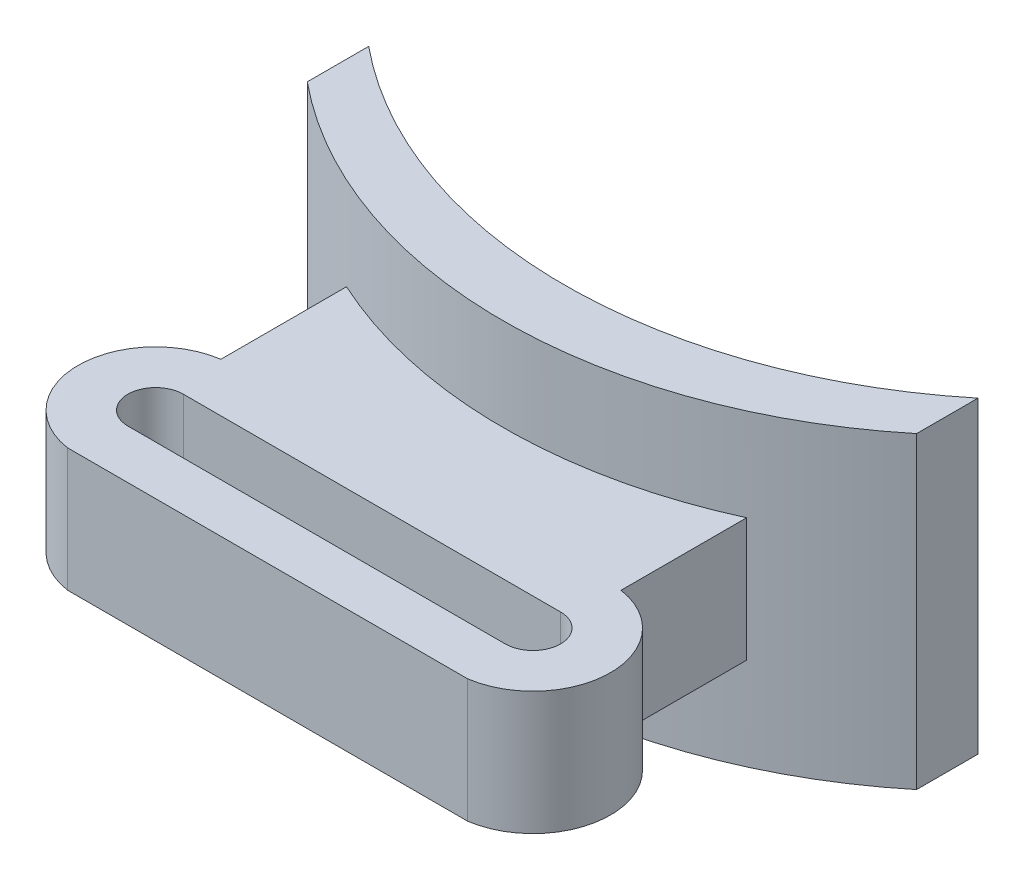
ISO-10303-21;
HEADER;
FILE_DESCRIPTION(('STEP AP214'),'2;1');
FILE_NAME('part.step','',(''),(''),'','','');
FILE_SCHEMA(('AUTOMOTIVE_DESIGN { 1 0 10303 214 1 1 1 1 }'));
ENDSEC;
DATA;
#1=APPLICATION_CONTEXT('core data for automotive mechanical design processes');
#2=APPLICATION_PROTOCOL_DEFINITION('international standard','automotive_design',2000,#1);
#3=PRODUCT_CONTEXT('',#1,'mechanical');
#4=PRODUCT('Part','Part','',(#3));
#5=PRODUCT_RELATED_PRODUCT_CATEGORY('part','',(#4));
#6=PRODUCT_DEFINITION_FORMATION('','',#4);
#7=PRODUCT_DEFINITION_CONTEXT('part definition',#1,'design');
#8=PRODUCT_DEFINITION('design','',#6,#7);
#9=PRODUCT_DEFINITION_SHAPE('','',#8);
#10=(LENGTH_UNIT() NAMED_UNIT(*) SI_UNIT(.MILLI.,.METRE.));
#11=(NAMED_UNIT(*) PLANE_ANGLE_UNIT() SI_UNIT($,.RADIAN.));
#12=(NAMED_UNIT(*) SI_UNIT($,.STERADIAN.) SOLID_ANGLE_UNIT());
#13=UNCERTAINTY_MEASURE_WITH_UNIT(LENGTH_MEASURE(1.E-05),#10,'distance_accuracy_value','');
#14=(GEOMETRIC_REPRESENTATION_CONTEXT(3) GLOBAL_UNCERTAINTY_ASSIGNED_CONTEXT((#13)) GLOBAL_UNIT_ASSIGNED_CONTEXT((#10,
#11,#12)) REPRESENTATION_CONTEXT('',''));
#15=CARTESIAN_POINT('',(0.,0.,0.));
#16=DIRECTION('',(0.,0.,1.));
#17=DIRECTION('',(1.,0.,0.));
#18=AXIS2_PLACEMENT_3D('',#15,#16,#17);
#19=CARTESIAN_POINT('',(0.,-7.9375,-24.0496748587012));
#20=DIRECTION('',(0.,1.,0.));
#21=DIRECTION('',(0.,0.,1.));
#22=AXIS2_PLACEMENT_3D('',#19,#20,#21);
#23=CYLINDRICAL_SURFACE('',#22,24.717492749883);
#24=CARTESIAN_POINT('',(0.,3.175,-24.0496748587012));
#25=DIRECTION('',(0.,1.,0.));
#26=DIRECTION('',(0.,0.,1.));
#27=AXIS2_PLACEMENT_3D('',#24,#25,#26);
#28=CIRCLE('',#27,24.717492749883);
#29=CARTESIAN_POINT('',(10.3008166228971,3.175,-1.58086036523122));
#30=VERTEX_POINT('',#29);
#31=CARTESIAN_POINT('',(-10.3008166228971,3.175,-1.58086036523122));
#32=VERTEX_POINT('',#31);
#33=EDGE_CURVE('E240',#30,#32,#28,.F.);
#34=ORIENTED_EDGE('',*,*,#33,.F.);
#35=DIRECTION('',(0.,-1.,0.));
#36=VECTOR('',#35,1.);
#37=CARTESIAN_POINT('',(10.3008166228971,3.175,-1.58086036523122));
#38=LINE('',#37,#36);
#39=CARTESIAN_POINT('',(10.3008166228971,-3.175,-1.58086036523122));
#40=VERTEX_POINT('',#39);
#41=EDGE_CURVE('E190',#30,#40,#38,.T.);
#42=ORIENTED_EDGE('',*,*,#41,.T.);
#43=CARTESIAN_POINT('',(0.,-3.175,-24.0496748587012));
#44=DIRECTION('',(0.,1.,0.));
#45=DIRECTION('',(0.,0.,1.));
#46=AXIS2_PLACEMENT_3D('',#43,#44,#45);
#47=CIRCLE('',#46,24.717492749883);
#48=CARTESIAN_POINT('',(-10.3008166228971,-3.175,-1.58086036523122));
#49=VERTEX_POINT('',#48);
#50=EDGE_CURVE('E232',#40,#49,#47,.F.);
#51=ORIENTED_EDGE('',*,*,#50,.T.);
#52=DIRECTION('',(0.,-1.,0.));
#53=VECTOR('',#52,1.);
#54=CARTESIAN_POINT('',(-10.3008166228971,3.175,-1.58086036523122));
#55=LINE('',#54,#53);
#56=EDGE_CURVE('E177',#32,#49,#55,.T.);
#57=ORIENTED_EDGE('',*,*,#56,.F.);
#58=EDGE_LOOP('',(#34,#42,#51,#57));
#59=FACE_BOUND('',#58,.T.);
#60=CARTESIAN_POINT('',(0.,7.9375,-24.0496748587012));
#61=DIRECTION('',(0.,1.,0.));
#62=DIRECTION('',(0.,0.,1.));
#63=AXIS2_PLACEMENT_3D('',#60,#61,#62);
#64=CIRCLE('',#63,24.717492749883);
#65=CARTESIAN_POINT('',(-15.6863180638042,7.9375,-4.94747934505177));
#66=VERTEX_POINT('',#65);
#67=CARTESIAN_POINT('',(15.6863180638042,7.9375,-4.94747934505178));
#68=VERTEX_POINT('',#67);
#69=EDGE_CURVE('E205',#66,#68,#64,.T.);
#70=ORIENTED_EDGE('',*,*,#69,.F.);
#71=DIRECTION('',(0.,1.,0.));
#72=VECTOR('',#71,1.);
#73=CARTESIAN_POINT('',(-15.6863180638042,-7.9375,-4.94747934505177));
#74=LINE('',#73,#72);
#75=CARTESIAN_POINT('',(-15.6863180638042,-7.9375,-4.94747934505177));
#76=VERTEX_POINT('',#75);
#77=EDGE_CURVE('E230',#76,#66,#74,.T.);
#78=ORIENTED_EDGE('',*,*,#77,.F.);
#79=CARTESIAN_POINT('',(0.,-7.9375,-24.0496748587012));
#80=DIRECTION('',(0.,1.,0.));
#81=DIRECTION('',(0.,0.,1.));
#82=AXIS2_PLACEMENT_3D('',#79,#80,#81);
#83=CIRCLE('',#82,24.717492749883);
#84=CARTESIAN_POINT('',(15.6863180638042,-7.9375,-4.94747934505178));
#85=VERTEX_POINT('',#84);
#86=EDGE_CURVE('E206',#76,#85,#83,.T.);
#87=ORIENTED_EDGE('',*,*,#86,.T.);
#88=DIRECTION('',(0.,1.,0.));
#89=VECTOR('',#88,1.);
#90=CARTESIAN_POINT('',(15.6863180638042,-7.9375,-4.94747934505178));
#91=LINE('',#90,#89);
#92=EDGE_CURVE('E219',#85,#68,#91,.T.);
#93=ORIENTED_EDGE('',*,*,#92,.T.);
#94=EDGE_LOOP('',(#70,#78,#87,#93));
#95=FACE_BOUND('',#94,.T.);
#96=ADVANCED_FACE('F36',(#59,#95),#23,.T.);
#97=CARTESIAN_POINT('',(-15.6863180638042,-7.9375,-8.10855378323306));
#98=DIRECTION('',(-1.,0.,0.));
#99=DIRECTION('',(0.,0.,1.));
#100=AXIS2_PLACEMENT_3D('',#97,#98,#99);
#101=PLANE('',#100);
#102=DIRECTION('',(0.,0.,1.));
#103=VECTOR('',#102,1.);
#104=CARTESIAN_POINT('',(-15.6863180638042,7.9375,-8.10855378323306));
#105=LINE('',#104,#103);
#106=CARTESIAN_POINT('',(-15.6863180638042,7.9375,-8.10855378323306));
#107=VERTEX_POINT('',#106);
#108=EDGE_CURVE('E210',#107,#66,#105,.T.);
#109=ORIENTED_EDGE('',*,*,#108,.F.);
#110=DIRECTION('',(0.,1.,0.));
#111=VECTOR('',#110,1.);
#112=CARTESIAN_POINT('',(-15.6863180638042,-7.9375,-8.10855378323306));
#113=LINE('',#112,#111);
#114=CARTESIAN_POINT('',(-15.6863180638042,-7.9375,-8.10855378323306));
#115=VERTEX_POINT('',#114);
#116=EDGE_CURVE('E233',#115,#107,#113,.T.);
#117=ORIENTED_EDGE('',*,*,#116,.F.);
#118=DIRECTION('',(0.,0.,1.));
#119=VECTOR('',#118,1.);
#120=CARTESIAN_POINT('',(-15.6863180638042,-7.9375,-8.10855378323306));
#121=LINE('',#120,#119);
#122=EDGE_CURVE('E216',#115,#76,#121,.T.);
#123=ORIENTED_EDGE('',*,*,#122,.T.);
#124=ORIENTED_EDGE('',*,*,#77,.T.);
#125=EDGE_LOOP('',(#109,#117,#123,#124));
#126=FACE_BOUND('',#125,.T.);
#127=ADVANCED_FACE('F263',(#126),#101,.T.);
#128=CARTESIAN_POINT('',(0.,-7.9375,-27.2721821088182));
#129=DIRECTION('',(0.,1.,0.));
#130=DIRECTION('',(0.,0.,1.));
#131=AXIS2_PLACEMENT_3D('',#128,#129,#130);
#132=CYLINDRICAL_SURFACE('',#131,24.765);
#133=CARTESIAN_POINT('',(0.,7.9375,-27.2721821088182));
#134=DIRECTION('',(0.,-1.,0.));
#135=DIRECTION('',(0.,0.,1.));
#136=AXIS2_PLACEMENT_3D('',#133,#134,#135);
#137=CIRCLE('',#136,24.765);
#138=CARTESIAN_POINT('',(15.6863180638042,7.9375,-8.10855378323306));
#139=VERTEX_POINT('',#138);
#140=EDGE_CURVE('E225',#139,#107,#137,.T.);
#141=ORIENTED_EDGE('',*,*,#140,.F.);
#142=DIRECTION('',(0.,1.,0.));
#143=VECTOR('',#142,1.);
#144=CARTESIAN_POINT('',(15.6863180638042,-7.9375,-8.10855378323306));
#145=LINE('',#144,#143);
#146=CARTESIAN_POINT('',(15.6863180638042,-7.9375,-8.10855378323306));
#147=VERTEX_POINT('',#146);
#148=EDGE_CURVE('E235',#147,#139,#145,.T.);
#149=ORIENTED_EDGE('',*,*,#148,.F.);
#150=CARTESIAN_POINT('',(0.,-7.9375,-27.2721821088182));
#151=DIRECTION('',(0.,-1.,0.));
#152=DIRECTION('',(0.,0.,1.));
#153=AXIS2_PLACEMENT_3D('',#150,#151,#152);
#154=CIRCLE('',#153,24.765);
#155=EDGE_CURVE('E213',#147,#115,#154,.T.);
#156=ORIENTED_EDGE('',*,*,#155,.T.);
#157=ORIENTED_EDGE('',*,*,#116,.T.);
#158=EDGE_LOOP('',(#141,#149,#156,#157));
#159=FACE_BOUND('',#158,.T.);
#160=ADVANCED_FACE('F268',(#159),#132,.F.);
#161=CARTESIAN_POINT('',(15.6863180638042,-7.9375,-8.10855378323306));
#162=DIRECTION('',(1.,0.,0.));
#163=DIRECTION('',(0.,0.,-1.));
#164=AXIS2_PLACEMENT_3D('',#161,#162,#163);
#165=PLANE('',#164);
#166=DIRECTION('',(0.,0.,-1.));
#167=VECTOR('',#166,1.);
#168=CARTESIAN_POINT('',(15.6863180638042,7.9375,-8.10855378323306));
#169=LINE('',#168,#167);
#170=EDGE_CURVE('E222',#68,#139,#169,.T.);
#171=ORIENTED_EDGE('',*,*,#170,.F.);
#172=ORIENTED_EDGE('',*,*,#92,.F.);
#173=DIRECTION('',(0.,0.,-1.));
#174=VECTOR('',#173,1.);
#175=CARTESIAN_POINT('',(15.6863180638042,-7.9375,-8.10855378323306));
#176=LINE('',#175,#174);
#177=EDGE_CURVE('E209',#85,#147,#176,.T.);
#178=ORIENTED_EDGE('',*,*,#177,.T.);
#179=ORIENTED_EDGE('',*,*,#148,.T.);
#180=EDGE_LOOP('',(#171,#172,#178,#179));
#181=FACE_BOUND('',#180,.T.);
#182=ADVANCED_FACE('F287',(#181),#165,.T.);
#183=CARTESIAN_POINT('',(0.,-7.9375,-24.0496748587012));
#184=DIRECTION('',(0.,1.,0.));
#185=DIRECTION('',(0.,0.,1.));
#186=AXIS2_PLACEMENT_3D('',#183,#184,#185);
#187=PLANE('',#186);
#188=ORIENTED_EDGE('',*,*,#86,.F.);
#189=ORIENTED_EDGE('',*,*,#122,.F.);
#190=ORIENTED_EDGE('',*,*,#155,.F.);
#191=ORIENTED_EDGE('',*,*,#177,.F.);
#192=EDGE_LOOP('',(#188,#189,#190,#191));
#193=FACE_BOUND('',#192,.T.);
#194=ADVANCED_FACE('F284',(#193),#187,.F.);
#195=CARTESIAN_POINT('',(0.,7.9375,-24.0496748587012));
#196=DIRECTION('',(0.,1.,0.));
#197=DIRECTION('',(0.,0.,1.));
#198=AXIS2_PLACEMENT_3D('',#195,#196,#197);
#199=PLANE('',#198);
#200=ORIENTED_EDGE('',*,*,#69,.T.);
#201=ORIENTED_EDGE('',*,*,#170,.T.);
#202=ORIENTED_EDGE('',*,*,#140,.T.);
#203=ORIENTED_EDGE('',*,*,#108,.T.);
#204=EDGE_LOOP('',(#200,#201,#202,#203));
#205=FACE_BOUND('',#204,.T.);
#206=ADVANCED_FACE('F279',(#205),#199,.T.);
#207=CARTESIAN_POINT('',(-10.3008166228971,3.175,-1.58086036523122));
#208=DIRECTION('',(1.,0.,0.));
#209=DIRECTION('',(0.,0.,-1.));
#210=AXIS2_PLACEMENT_3D('',#207,#208,#209);
#211=PLANE('',#210);
#212=DIRECTION('',(0.,0.,1.));
#213=VECTOR('',#212,1.);
#214=CARTESIAN_POINT('',(-10.3008166228971,-3.175,-1.58086036523122));
#215=LINE('',#214,#213);
#216=CARTESIAN_POINT('',(-10.3008166228971,-3.175,4.88640215165273));
#217=VERTEX_POINT('',#216);
#218=EDGE_CURVE('E162',#49,#217,#215,.T.);
#219=ORIENTED_EDGE('',*,*,#218,.T.);
#220=DIRECTION('',(0.,-1.,0.));
#221=VECTOR('',#220,1.);
#222=CARTESIAN_POINT('',(-10.3008166228971,3.175,4.88640215165273));
#223=LINE('',#222,#221);
#224=CARTESIAN_POINT('',(-10.3008166228971,3.175,4.88640215165273));
#225=VERTEX_POINT('',#224);
#226=EDGE_CURVE('E202',#225,#217,#223,.T.);
#227=ORIENTED_EDGE('',*,*,#226,.F.);
#228=DIRECTION('',(0.,0.,1.));
#229=VECTOR('',#228,1.);
#230=CARTESIAN_POINT('',(-10.3008166228971,3.175,-1.58086036523122));
#231=LINE('',#230,#229);
#232=EDGE_CURVE('E165',#32,#225,#231,.T.);
#233=ORIENTED_EDGE('',*,*,#232,.F.);
#234=ORIENTED_EDGE('',*,*,#56,.T.);
#235=EDGE_LOOP('',(#219,#227,#233,#234));
#236=FACE_BOUND('',#235,.T.);
#237=ADVANCED_FACE('F297',(#236),#211,.F.);
#238=CARTESIAN_POINT('',(-9.7139709367565,3.175,8.83446713905467));
#239=DIRECTION('',(0.,-1.,0.));
#240=DIRECTION('',(0.,0.,-1.));
#241=AXIS2_PLACEMENT_3D('',#238,#239,#240);
#242=CYLINDRICAL_SURFACE('',#241,3.99144146945572);
#243=CARTESIAN_POINT('',(-9.7139709367565,-3.175,8.83446713905467));
#244=DIRECTION('',(0.,1.,0.));
#245=DIRECTION('',(0.,0.,1.));
#246=AXIS2_PLACEMENT_3D('',#243,#244,#245);
#247=CIRCLE('',#246,3.99144146945572);
#248=CARTESIAN_POINT('',(-10.3008166228971,-3.175,12.7825321264566));
#249=VERTEX_POINT('',#248);
#250=EDGE_CURVE('E180',#217,#249,#247,.T.);
#251=ORIENTED_EDGE('',*,*,#250,.T.);
#252=DIRECTION('',(0.,-1.,0.));
#253=VECTOR('',#252,1.);
#254=CARTESIAN_POINT('',(-10.3008166228971,3.175,12.7825321264566));
#255=LINE('',#254,#253);
#256=CARTESIAN_POINT('',(-10.3008166228971,3.175,12.7825321264566));
#257=VERTEX_POINT('',#256);
#258=EDGE_CURVE('E199',#257,#249,#255,.T.);
#259=ORIENTED_EDGE('',*,*,#258,.F.);
#260=CARTESIAN_POINT('',(-9.7139709367565,3.175,8.83446713905467));
#261=DIRECTION('',(0.,1.,0.));
#262=DIRECTION('',(0.,0.,1.));
#263=AXIS2_PLACEMENT_3D('',#260,#261,#262);
#264=CIRCLE('',#263,3.99144146945572);
#265=EDGE_CURVE('E168',#225,#257,#264,.T.);
#266=ORIENTED_EDGE('',*,*,#265,.F.);
#267=ORIENTED_EDGE('',*,*,#226,.T.);
#268=EDGE_LOOP('',(#251,#259,#266,#267));
#269=FACE_BOUND('',#268,.T.);
#270=ADVANCED_FACE('F302',(#269),#242,.T.);
#271=CARTESIAN_POINT('',(-10.3008166228971,3.175,12.7825321264566));
#272=DIRECTION('',(0.,0.,-1.));
#273=DIRECTION('',(-1.,0.,0.));
#274=AXIS2_PLACEMENT_3D('',#271,#272,#273);
#275=PLANE('',#274);
#276=DIRECTION('',(1.,0.,0.));
#277=VECTOR('',#276,1.);
#278=CARTESIAN_POINT('',(-10.3008166228971,-3.175,12.7825321264566));
#279=LINE('',#278,#277);
#280=CARTESIAN_POINT('',(10.3008166228971,-3.175,12.7825321264566));
#281=VERTEX_POINT('',#280);
#282=EDGE_CURVE('E182',#249,#281,#279,.T.);
#283=ORIENTED_EDGE('',*,*,#282,.T.);
#284=DIRECTION('',(0.,-1.,0.));
#285=VECTOR('',#284,1.);
#286=CARTESIAN_POINT('',(10.3008166228971,3.175,12.7825321264566));
#287=LINE('',#286,#285);
#288=CARTESIAN_POINT('',(10.3008166228971,3.175,12.7825321264566));
#289=VERTEX_POINT('',#288);
#290=EDGE_CURVE('E196',#289,#281,#287,.T.);
#291=ORIENTED_EDGE('',*,*,#290,.F.);
#292=DIRECTION('',(1.,0.,0.));
#293=VECTOR('',#292,1.);
#294=CARTESIAN_POINT('',(-10.3008166228971,3.175,12.7825321264566));
#295=LINE('',#294,#293);
#296=EDGE_CURVE('E171',#257,#289,#295,.T.);
#297=ORIENTED_EDGE('',*,*,#296,.F.);
#298=ORIENTED_EDGE('',*,*,#258,.T.);
#299=EDGE_LOOP('',(#283,#291,#297,#298));
#300=FACE_BOUND('',#299,.T.);
#301=ADVANCED_FACE('F306',(#300),#275,.F.);
#302=CARTESIAN_POINT('',(9.7139709367565,3.175,8.83446713905467));
#303=DIRECTION('',(0.,-1.,0.));
#304=DIRECTION('',(0.,0.,-1.));
#305=AXIS2_PLACEMENT_3D('',#302,#303,#304);
#306=CYLINDRICAL_SURFACE('',#305,3.99144146945572);
#307=CARTESIAN_POINT('',(9.7139709367565,-3.175,8.83446713905467));
#308=DIRECTION('',(0.,1.,0.));
#309=DIRECTION('',(0.,0.,1.));
#310=AXIS2_PLACEMENT_3D('',#307,#308,#309);
#311=CIRCLE('',#310,3.99144146945572);
#312=CARTESIAN_POINT('',(10.3008166228971,-3.175,4.88640215165273));
#313=VERTEX_POINT('',#312);
#314=EDGE_CURVE('E184',#281,#313,#311,.T.);
#315=ORIENTED_EDGE('',*,*,#314,.T.);
#316=DIRECTION('',(0.,-1.,0.));
#317=VECTOR('',#316,1.);
#318=CARTESIAN_POINT('',(10.3008166228971,3.175,4.88640215165273));
#319=LINE('',#318,#317);
#320=CARTESIAN_POINT('',(10.3008166228971,3.175,4.88640215165273));
#321=VERTEX_POINT('',#320);
#322=EDGE_CURVE('E193',#321,#313,#319,.T.);
#323=ORIENTED_EDGE('',*,*,#322,.F.);
#324=CARTESIAN_POINT('',(9.7139709367565,3.175,8.83446713905467));
#325=DIRECTION('',(0.,1.,0.));
#326=DIRECTION('',(0.,0.,1.));
#327=AXIS2_PLACEMENT_3D('',#324,#325,#326);
#328=CIRCLE('',#327,3.99144146945572);
#329=EDGE_CURVE('E173',#289,#321,#328,.T.);
#330=ORIENTED_EDGE('',*,*,#329,.F.);
#331=ORIENTED_EDGE('',*,*,#290,.T.);
#332=EDGE_LOOP('',(#315,#323,#330,#331));
#333=FACE_BOUND('',#332,.T.);
#334=ADVANCED_FACE('F310',(#333),#306,.T.);
#335=CARTESIAN_POINT('',(10.3008166228971,3.175,-1.58086036523122));
#336=DIRECTION('',(-1.,0.,0.));
#337=DIRECTION('',(0.,0.,1.));
#338=AXIS2_PLACEMENT_3D('',#335,#336,#337);
#339=PLANE('',#338);
#340=DIRECTION('',(0.,0.,-1.));
#341=VECTOR('',#340,1.);
#342=CARTESIAN_POINT('',(10.3008166228971,-3.175,-1.58086036523122));
#343=LINE('',#342,#341);
#344=EDGE_CURVE('E169',#313,#40,#343,.T.);
#345=ORIENTED_EDGE('',*,*,#344,.T.);
#346=ORIENTED_EDGE('',*,*,#41,.F.);
#347=DIRECTION('',(0.,0.,-1.));
#348=VECTOR('',#347,1.);
#349=CARTESIAN_POINT('',(10.3008166228971,3.175,-1.58086036523122));
#350=LINE('',#349,#348);
#351=EDGE_CURVE('E175',#321,#30,#350,.T.);
#352=ORIENTED_EDGE('',*,*,#351,.F.);
#353=ORIENTED_EDGE('',*,*,#322,.T.);
#354=EDGE_LOOP('',(#345,#346,#352,#353));
#355=FACE_BOUND('',#354,.T.);
#356=ADVANCED_FACE('F314',(#355),#339,.F.);
#357=CARTESIAN_POINT('',(-9.7139709367565,3.175,8.83446713905467));
#358=DIRECTION('',(0.,1.,0.));
#359=DIRECTION('',(0.,0.,1.));
#360=AXIS2_PLACEMENT_3D('',#357,#358,#359);
#361=PLANE('',#360);
#362=CARTESIAN_POINT('',(-9.7139709367565,3.175,8.83446713905467));
#363=DIRECTION('',(0.,1.,0.));
#364=DIRECTION('',(0.,0.,1.));
#365=AXIS2_PLACEMENT_3D('',#362,#363,#364);
#366=CIRCLE('',#365,1.42435358230863);
#367=CARTESIAN_POINT('',(-9.7139709367565,3.175,7.41011355674604));
#368=VERTEX_POINT('',#367);
#369=CARTESIAN_POINT('',(-9.7139709367565,3.175,10.2588207213633));
#370=VERTEX_POINT('',#369);
#371=EDGE_CURVE('E50',#368,#370,#366,.T.);
#372=ORIENTED_EDGE('',*,*,#371,.F.);
#373=DIRECTION('',(-1.,0.,0.));
#374=VECTOR('',#373,1.);
#375=CARTESIAN_POINT('',(-9.7139709367565,3.175,7.41011355674604));
#376=LINE('',#375,#374);
#377=CARTESIAN_POINT('',(9.7139709367565,3.175,7.41011355674604));
#378=VERTEX_POINT('',#377);
#379=EDGE_CURVE('E155',#378,#368,#376,.T.);
#380=ORIENTED_EDGE('',*,*,#379,.F.);
#381=CARTESIAN_POINT('',(9.7139709367565,3.175,8.83446713905467));
#382=DIRECTION('',(0.,1.,0.));
#383=DIRECTION('',(0.,0.,1.));
#384=AXIS2_PLACEMENT_3D('',#381,#382,#383);
#385=CIRCLE('',#384,1.42435358230863);
#386=CARTESIAN_POINT('',(9.7139709367565,3.175,10.2588207213633));
#387=VERTEX_POINT('',#386);
#388=EDGE_CURVE('E139',#387,#378,#385,.T.);
#389=ORIENTED_EDGE('',*,*,#388,.F.);
#390=DIRECTION('',(1.,0.,0.));
#391=VECTOR('',#390,1.);
#392=CARTESIAN_POINT('',(-9.7139709367565,3.175,10.2588207213633));
#393=LINE('',#392,#391);
#394=EDGE_CURVE('E148',#370,#387,#393,.T.);
#395=ORIENTED_EDGE('',*,*,#394,.F.);
#396=EDGE_LOOP('',(#372,#380,#389,#395));
#397=FACE_BOUND('',#396,.T.);
#398=ORIENTED_EDGE('',*,*,#351,.T.);
#399=ORIENTED_EDGE('',*,*,#33,.T.);
#400=ORIENTED_EDGE('',*,*,#232,.T.);
#401=ORIENTED_EDGE('',*,*,#265,.T.);
#402=ORIENTED_EDGE('',*,*,#296,.T.);
#403=ORIENTED_EDGE('',*,*,#329,.T.);
#404=EDGE_LOOP('',(#398,#399,#400,#401,#402,#403));
#405=FACE_BOUND('',#404,.T.);
#406=ADVANCED_FACE('F152',(#397,#405),#361,.T.);
#407=CARTESIAN_POINT('',(-9.7139709367565,-3.175,8.83446713905467));
#408=DIRECTION('',(0.,1.,0.));
#409=DIRECTION('',(0.,0.,1.));
#410=AXIS2_PLACEMENT_3D('',#407,#408,#409);
#411=PLANE('',#410);
#412=DIRECTION('',(-1.,0.,0.));
#413=VECTOR('',#412,1.);
#414=CARTESIAN_POINT('',(-9.7139709367565,-3.175,7.41011355674604));
#415=LINE('',#414,#413);
#416=CARTESIAN_POINT('',(9.7139709367565,-3.175,7.41011355674604));
#417=VERTEX_POINT('',#416);
#418=CARTESIAN_POINT('',(-9.7139709367565,-3.175,7.41011355674604));
#419=VERTEX_POINT('',#418);
#420=EDGE_CURVE('E43',#417,#419,#415,.T.);
#421=ORIENTED_EDGE('',*,*,#420,.T.);
#422=CARTESIAN_POINT('',(-9.7139709367565,-3.175,8.83446713905467));
#423=DIRECTION('',(0.,1.,0.));
#424=DIRECTION('',(0.,0.,1.));
#425=AXIS2_PLACEMENT_3D('',#422,#423,#424);
#426=CIRCLE('',#425,1.42435358230863);
#427=CARTESIAN_POINT('',(-9.7139709367565,-3.175,10.2588207213633));
#428=VERTEX_POINT('',#427);
#429=EDGE_CURVE('E11',#419,#428,#426,.T.);
#430=ORIENTED_EDGE('',*,*,#429,.T.);
#431=DIRECTION('',(1.,0.,0.));
#432=VECTOR('',#431,1.);
#433=CARTESIAN_POINT('',(-9.7139709367565,-3.175,10.2588207213633));
#434=LINE('',#433,#432);
#435=CARTESIAN_POINT('',(9.7139709367565,-3.175,10.2588207213633));
#436=VERTEX_POINT('',#435);
#437=EDGE_CURVE('E242',#428,#436,#434,.T.);
#438=ORIENTED_EDGE('',*,*,#437,.T.);
#439=CARTESIAN_POINT('',(9.7139709367565,-3.175,8.83446713905467));
#440=DIRECTION('',(0.,1.,0.));
#441=DIRECTION('',(0.,0.,1.));
#442=AXIS2_PLACEMENT_3D('',#439,#440,#441);
#443=CIRCLE('',#442,1.42435358230863);
#444=EDGE_CURVE('E142',#436,#417,#443,.T.);
#445=ORIENTED_EDGE('',*,*,#444,.T.);
#446=EDGE_LOOP('',(#421,#430,#438,#445));
#447=FACE_BOUND('',#446,.T.);
#448=ORIENTED_EDGE('',*,*,#50,.F.);
#449=ORIENTED_EDGE('',*,*,#344,.F.);
#450=ORIENTED_EDGE('',*,*,#314,.F.);
#451=ORIENTED_EDGE('',*,*,#282,.F.);
#452=ORIENTED_EDGE('',*,*,#250,.F.);
#453=ORIENTED_EDGE('',*,*,#218,.F.);
#454=EDGE_LOOP('',(#448,#449,#450,#451,#452,#453));
#455=FACE_BOUND('',#454,.T.);
#456=ADVANCED_FACE('F246',(#447,#455),#411,.F.);
#457=CARTESIAN_POINT('',(-9.7139709367565,-7.9375,8.83446713905467));
#458=DIRECTION('',(0.,1.,0.));
#459=DIRECTION('',(0.,0.,1.));
#460=AXIS2_PLACEMENT_3D('',#457,#458,#459);
#461=CYLINDRICAL_SURFACE('',#460,1.42435358230863);
#462=DIRECTION('',(0.,1.,0.));
#463=VECTOR('',#462,1.);
#464=CARTESIAN_POINT('',(-9.7139709367565,-7.9375,7.41011355674604));
#465=LINE('',#464,#463);
#466=EDGE_CURVE('E160',#419,#368,#465,.T.);
#467=ORIENTED_EDGE('',*,*,#466,.T.);
#468=ORIENTED_EDGE('',*,*,#371,.T.);
#469=DIRECTION('',(0.,1.,0.));
#470=VECTOR('',#469,1.);
#471=CARTESIAN_POINT('',(-9.7139709367565,-7.9375,10.2588207213633));
#472=LINE('',#471,#470);
#473=EDGE_CURVE('E145',#428,#370,#472,.T.);
#474=ORIENTED_EDGE('',*,*,#473,.F.);
#475=ORIENTED_EDGE('',*,*,#429,.F.);
#476=EDGE_LOOP('',(#467,#468,#474,#475));
#477=FACE_BOUND('',#476,.T.);
#478=ADVANCED_FACE('F251',(#477),#461,.F.);
#479=CARTESIAN_POINT('',(-9.7139709367565,-7.9375,7.41011355674604));
#480=DIRECTION('',(0.,0.,-1.));
#481=DIRECTION('',(-1.,0.,0.));
#482=AXIS2_PLACEMENT_3D('',#479,#480,#481);
#483=PLANE('',#482);
#484=DIRECTION('',(0.,1.,0.));
#485=VECTOR('',#484,1.);
#486=CARTESIAN_POINT('',(9.7139709367565,-7.9375,7.41011355674604));
#487=LINE('',#486,#485);
#488=EDGE_CURVE('E144',#417,#378,#487,.T.);
#489=ORIENTED_EDGE('',*,*,#488,.T.);
#490=ORIENTED_EDGE('',*,*,#379,.T.);
#491=ORIENTED_EDGE('',*,*,#466,.F.);
#492=ORIENTED_EDGE('',*,*,#420,.F.);
#493=EDGE_LOOP('',(#489,#490,#491,#492));
#494=FACE_BOUND('',#493,.T.);
#495=ADVANCED_FACE('F250',(#494),#483,.F.);
#496=CARTESIAN_POINT('',(9.7139709367565,-7.9375,8.83446713905467));
#497=DIRECTION('',(0.,1.,0.));
#498=DIRECTION('',(0.,0.,1.));
#499=AXIS2_PLACEMENT_3D('',#496,#497,#498);
#500=CYLINDRICAL_SURFACE('',#499,1.42435358230863);
#501=DIRECTION('',(0.,1.,0.));
#502=VECTOR('',#501,1.);
#503=CARTESIAN_POINT('',(9.7139709367565,-7.9375,10.2588207213633));
#504=LINE('',#503,#502);
#505=EDGE_CURVE('E58',#436,#387,#504,.T.);
#506=ORIENTED_EDGE('',*,*,#505,.T.);
#507=ORIENTED_EDGE('',*,*,#388,.T.);
#508=ORIENTED_EDGE('',*,*,#488,.F.);
#509=ORIENTED_EDGE('',*,*,#444,.F.);
#510=EDGE_LOOP('',(#506,#507,#508,#509));
#511=FACE_BOUND('',#510,.T.);
#512=ADVANCED_FACE('F136',(#511),#500,.F.);
#513=CARTESIAN_POINT('',(-9.7139709367565,-7.9375,10.2588207213633));
#514=DIRECTION('',(0.,0.,1.));
#515=DIRECTION('',(1.,0.,0.));
#516=AXIS2_PLACEMENT_3D('',#513,#514,#515);
#517=PLANE('',#516);
#518=ORIENTED_EDGE('',*,*,#473,.T.);
#519=ORIENTED_EDGE('',*,*,#394,.T.);
#520=ORIENTED_EDGE('',*,*,#505,.F.);
#521=ORIENTED_EDGE('',*,*,#437,.F.);
#522=EDGE_LOOP('',(#518,#519,#520,#521));
#523=FACE_BOUND('',#522,.T.);
#524=ADVANCED_FACE('F149',(#523),#517,.F.);
#525=CLOSED_SHELL('',(#96,#127,#160,#182,#194,#206,#237,#270,#301,#334,#356,#406,#456,#478,#495,
#512,#524));
#526=MANIFOLD_SOLID_BREP('B2',#525);
#527=ADVANCED_BREP_SHAPE_REPRESENTATION('',(#18,#526),#14);
#528=SHAPE_DEFINITION_REPRESENTATION(#9,#527);
ENDSEC;
END-ISO-10303-21;
